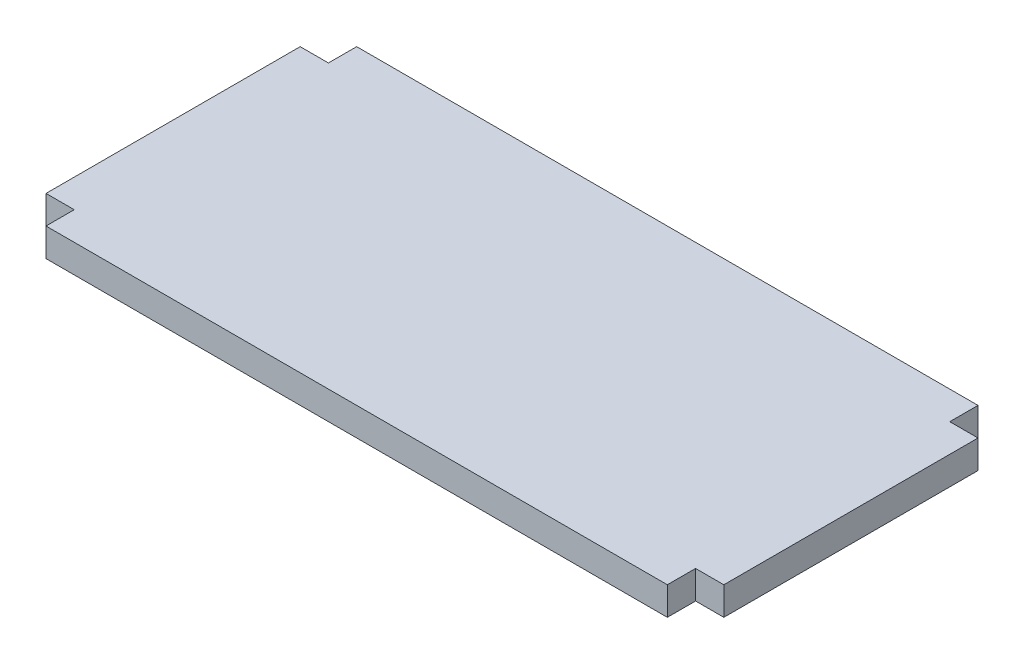
ISO-10303-21;
HEADER;
FILE_DESCRIPTION(('STEP AP214'),'2;1');
FILE_NAME('part.step','',(''),(''),'','','');
FILE_SCHEMA(('AUTOMOTIVE_DESIGN { 1 0 10303 214 1 1 1 1 }'));
ENDSEC;
DATA;
#1=APPLICATION_CONTEXT('core data for automotive mechanical design processes');
#2=APPLICATION_PROTOCOL_DEFINITION('international standard','automotive_design',2000,#1);
#3=PRODUCT_CONTEXT('',#1,'mechanical');
#4=PRODUCT('Part','Part','',(#3));
#5=PRODUCT_RELATED_PRODUCT_CATEGORY('part','',(#4));
#6=PRODUCT_DEFINITION_FORMATION('','',#4);
#7=PRODUCT_DEFINITION_CONTEXT('part definition',#1,'design');
#8=PRODUCT_DEFINITION('design','',#6,#7);
#9=PRODUCT_DEFINITION_SHAPE('','',#8);
#10=(LENGTH_UNIT() NAMED_UNIT(*) SI_UNIT(.MILLI.,.METRE.));
#11=(NAMED_UNIT(*) PLANE_ANGLE_UNIT() SI_UNIT($,.RADIAN.));
#12=(NAMED_UNIT(*) SI_UNIT($,.STERADIAN.) SOLID_ANGLE_UNIT());
#13=UNCERTAINTY_MEASURE_WITH_UNIT(LENGTH_MEASURE(1.E-05),#10,'distance_accuracy_value','');
#14=(GEOMETRIC_REPRESENTATION_CONTEXT(3) GLOBAL_UNCERTAINTY_ASSIGNED_CONTEXT((#13)) GLOBAL_UNIT_ASSIGNED_CONTEXT((#10,
#11,#12)) REPRESENTATION_CONTEXT('',''));
#15=CARTESIAN_POINT('',(0.,0.,0.));
#16=DIRECTION('',(0.,0.,1.));
#17=DIRECTION('',(1.,0.,0.));
#18=AXIS2_PLACEMENT_3D('',#15,#16,#17);
#19=CARTESIAN_POINT('',(0.,50.,225.));
#20=DIRECTION('',(0.,0.,-1.));
#21=DIRECTION('',(-1.,0.,0.));
#22=AXIS2_PLACEMENT_3D('',#19,#20,#21);
#23=PLANE('',#22);
#24=DIRECTION('',(1.,0.,0.));
#25=VECTOR('',#24,1.);
#26=CARTESIAN_POINT('',(0.,0.,225.));
#27=LINE('',#26,#25);
#28=CARTESIAN_POINT('',(-600.,0.,225.));
#29=VERTEX_POINT('',#28);
#30=CARTESIAN_POINT('',(-550.,0.,225.));
#31=VERTEX_POINT('',#30);
#32=EDGE_CURVE('E175',#29,#31,#27,.T.);
#33=ORIENTED_EDGE('',*,*,#32,.T.);
#34=DIRECTION('',(0.,-1.,0.));
#35=VECTOR('',#34,1.);
#36=CARTESIAN_POINT('',(-550.,50.,225.));
#37=LINE('',#36,#35);
#38=CARTESIAN_POINT('',(-550.,50.,225.));
#39=VERTEX_POINT('',#38);
#40=EDGE_CURVE('E11',#39,#31,#37,.T.);
#41=ORIENTED_EDGE('',*,*,#40,.F.);
#42=DIRECTION('',(1.,0.,0.));
#43=VECTOR('',#42,1.);
#44=CARTESIAN_POINT('',(0.,50.,225.));
#45=LINE('',#44,#43);
#46=CARTESIAN_POINT('',(-600.,50.,225.));
#47=VERTEX_POINT('',#46);
#48=EDGE_CURVE('E217',#47,#39,#45,.T.);
#49=ORIENTED_EDGE('',*,*,#48,.F.);
#50=DIRECTION('',(0.,-1.,0.));
#51=VECTOR('',#50,1.);
#52=CARTESIAN_POINT('',(-600.,50.,225.));
#53=LINE('',#52,#51);
#54=EDGE_CURVE('E171',#47,#29,#53,.T.);
#55=ORIENTED_EDGE('',*,*,#54,.T.);
#56=EDGE_LOOP('',(#33,#41,#49,#55));
#57=FACE_BOUND('',#56,.T.);
#58=ADVANCED_FACE('F51',(#57),#23,.F.);
#59=CARTESIAN_POINT('',(-549.999999999999,50.,-1.22124532708768E-12));
#60=DIRECTION('',(1.,0.,0.));
#61=DIRECTION('',(0.,0.,-1.));
#62=AXIS2_PLACEMENT_3D('',#59,#60,#61);
#63=PLANE('',#62);
#64=DIRECTION('',(0.,0.,1.));
#65=VECTOR('',#64,1.);
#66=CARTESIAN_POINT('',(-549.999999999999,0.,-1.22124532708768E-12));
#67=LINE('',#66,#65);
#68=CARTESIAN_POINT('',(-550.,0.,275.));
#69=VERTEX_POINT('',#68);
#70=EDGE_CURVE('E179',#31,#69,#67,.T.);
#71=ORIENTED_EDGE('',*,*,#70,.T.);
#72=DIRECTION('',(0.,-1.,0.));
#73=VECTOR('',#72,1.);
#74=CARTESIAN_POINT('',(-550.,50.,275.));
#75=LINE('',#74,#73);
#76=CARTESIAN_POINT('',(-550.,50.,275.));
#77=VERTEX_POINT('',#76);
#78=EDGE_CURVE('E60',#77,#69,#75,.T.);
#79=ORIENTED_EDGE('',*,*,#78,.F.);
#80=DIRECTION('',(0.,0.,1.));
#81=VECTOR('',#80,1.);
#82=CARTESIAN_POINT('',(-549.999999999999,50.,-1.22124532708768E-12));
#83=LINE('',#82,#81);
#84=EDGE_CURVE('E119',#39,#77,#83,.T.);
#85=ORIENTED_EDGE('',*,*,#84,.F.);
#86=ORIENTED_EDGE('',*,*,#40,.T.);
#87=EDGE_LOOP('',(#71,#79,#85,#86));
#88=FACE_BOUND('',#87,.T.);
#89=ADVANCED_FACE('F299',(#88),#63,.F.);
#90=CARTESIAN_POINT('',(0.,50.,275.));
#91=DIRECTION('',(0.,0.,-1.));
#92=DIRECTION('',(-1.,0.,0.));
#93=AXIS2_PLACEMENT_3D('',#90,#91,#92);
#94=PLANE('',#93);
#95=DIRECTION('',(1.,0.,0.));
#96=VECTOR('',#95,1.);
#97=CARTESIAN_POINT('',(0.,0.,275.));
#98=LINE('',#97,#96);
#99=CARTESIAN_POINT('',(550.,0.,275.));
#100=VERTEX_POINT('',#99);
#101=EDGE_CURVE('E182',#69,#100,#98,.T.);
#102=ORIENTED_EDGE('',*,*,#101,.T.);
#103=DIRECTION('',(0.,-1.,0.));
#104=VECTOR('',#103,1.);
#105=CARTESIAN_POINT('',(550.,50.,275.));
#106=LINE('',#105,#104);
#107=CARTESIAN_POINT('',(550.,50.,275.));
#108=VERTEX_POINT('',#107);
#109=EDGE_CURVE('E239',#108,#100,#106,.T.);
#110=ORIENTED_EDGE('',*,*,#109,.F.);
#111=DIRECTION('',(1.,0.,0.));
#112=VECTOR('',#111,1.);
#113=CARTESIAN_POINT('',(0.,50.,275.));
#114=LINE('',#113,#112);
#115=EDGE_CURVE('E248',#77,#108,#114,.T.);
#116=ORIENTED_EDGE('',*,*,#115,.F.);
#117=ORIENTED_EDGE('',*,*,#78,.T.);
#118=EDGE_LOOP('',(#102,#110,#116,#117));
#119=FACE_BOUND('',#118,.T.);
#120=ADVANCED_FACE('F246',(#119),#94,.F.);
#121=CARTESIAN_POINT('',(550.,50.,0.));
#122=DIRECTION('',(1.,0.,0.));
#123=DIRECTION('',(0.,0.,-1.));
#124=AXIS2_PLACEMENT_3D('',#121,#122,#123);
#125=PLANE('',#124);
#126=DIRECTION('',(0.,0.,1.));
#127=VECTOR('',#126,1.);
#128=CARTESIAN_POINT('',(550.,0.,0.));
#129=LINE('',#128,#127);
#130=CARTESIAN_POINT('',(550.,0.,225.));
#131=VERTEX_POINT('',#130);
#132=EDGE_CURVE('E186',#131,#100,#129,.T.);
#133=ORIENTED_EDGE('',*,*,#132,.F.);
#134=DIRECTION('',(0.,-1.,0.));
#135=VECTOR('',#134,1.);
#136=CARTESIAN_POINT('',(550.,50.,225.));
#137=LINE('',#136,#135);
#138=CARTESIAN_POINT('',(550.,50.,225.));
#139=VERTEX_POINT('',#138);
#140=EDGE_CURVE('E236',#139,#131,#137,.T.);
#141=ORIENTED_EDGE('',*,*,#140,.F.);
#142=DIRECTION('',(0.,0.,1.));
#143=VECTOR('',#142,1.);
#144=CARTESIAN_POINT('',(550.,50.,0.));
#145=LINE('',#144,#143);
#146=EDGE_CURVE('E259',#139,#108,#145,.T.);
#147=ORIENTED_EDGE('',*,*,#146,.T.);
#148=ORIENTED_EDGE('',*,*,#109,.T.);
#149=EDGE_LOOP('',(#133,#141,#147,#148));
#150=FACE_BOUND('',#149,.T.);
#151=ADVANCED_FACE('F255',(#150),#125,.T.);
#152=CARTESIAN_POINT('',(0.,50.,225.));
#153=DIRECTION('',(0.,0.,-1.));
#154=DIRECTION('',(-1.,0.,0.));
#155=AXIS2_PLACEMENT_3D('',#152,#153,#154);
#156=PLANE('',#155);
#157=DIRECTION('',(1.,0.,0.));
#158=VECTOR('',#157,1.);
#159=CARTESIAN_POINT('',(0.,0.,225.));
#160=LINE('',#159,#158);
#161=CARTESIAN_POINT('',(600.,0.,225.));
#162=VERTEX_POINT('',#161);
#163=EDGE_CURVE('E190',#131,#162,#160,.T.);
#164=ORIENTED_EDGE('',*,*,#163,.T.);
#165=DIRECTION('',(0.,-1.,0.));
#166=VECTOR('',#165,1.);
#167=CARTESIAN_POINT('',(600.,50.,225.));
#168=LINE('',#167,#166);
#169=CARTESIAN_POINT('',(600.,50.,225.));
#170=VERTEX_POINT('',#169);
#171=EDGE_CURVE('E233',#170,#162,#168,.T.);
#172=ORIENTED_EDGE('',*,*,#171,.F.);
#173=DIRECTION('',(1.,0.,0.));
#174=VECTOR('',#173,1.);
#175=CARTESIAN_POINT('',(0.,50.,225.));
#176=LINE('',#175,#174);
#177=EDGE_CURVE('E261',#139,#170,#176,.T.);
#178=ORIENTED_EDGE('',*,*,#177,.F.);
#179=ORIENTED_EDGE('',*,*,#140,.T.);
#180=EDGE_LOOP('',(#164,#172,#178,#179));
#181=FACE_BOUND('',#180,.T.);
#182=ADVANCED_FACE('F310',(#181),#156,.F.);
#183=CARTESIAN_POINT('',(600.,50.,-1.21115239050017E-13));
#184=DIRECTION('',(1.,0.,0.));
#185=DIRECTION('',(0.,0.,-1.));
#186=AXIS2_PLACEMENT_3D('',#183,#184,#185);
#187=PLANE('',#186);
#188=DIRECTION('',(0.,0.,1.));
#189=VECTOR('',#188,1.);
#190=CARTESIAN_POINT('',(600.,0.,-1.21115239050017E-13));
#191=LINE('',#190,#189);
#192=CARTESIAN_POINT('',(600.,0.,-225.));
#193=VERTEX_POINT('',#192);
#194=EDGE_CURVE('E194',#193,#162,#191,.T.);
#195=ORIENTED_EDGE('',*,*,#194,.F.);
#196=DIRECTION('',(0.,-1.,0.));
#197=VECTOR('',#196,1.);
#198=CARTESIAN_POINT('',(600.,50.,-225.));
#199=LINE('',#198,#197);
#200=CARTESIAN_POINT('',(600.,50.,-225.));
#201=VERTEX_POINT('',#200);
#202=EDGE_CURVE('E230',#201,#193,#199,.T.);
#203=ORIENTED_EDGE('',*,*,#202,.F.);
#204=DIRECTION('',(0.,0.,1.));
#205=VECTOR('',#204,1.);
#206=CARTESIAN_POINT('',(600.,50.,-1.21115239050017E-13));
#207=LINE('',#206,#205);
#208=EDGE_CURVE('E265',#201,#170,#207,.T.);
#209=ORIENTED_EDGE('',*,*,#208,.T.);
#210=ORIENTED_EDGE('',*,*,#171,.T.);
#211=EDGE_LOOP('',(#195,#203,#209,#210));
#212=FACE_BOUND('',#211,.T.);
#213=ADVANCED_FACE('F313',(#212),#187,.T.);
#214=CARTESIAN_POINT('',(0.,50.,-225.));
#215=DIRECTION('',(0.,0.,-1.));
#216=DIRECTION('',(-1.,0.,0.));
#217=AXIS2_PLACEMENT_3D('',#214,#215,#216);
#218=PLANE('',#217);
#219=DIRECTION('',(1.,0.,0.));
#220=VECTOR('',#219,1.);
#221=CARTESIAN_POINT('',(0.,0.,-225.));
#222=LINE('',#221,#220);
#223=CARTESIAN_POINT('',(550.,0.,-225.));
#224=VERTEX_POINT('',#223);
#225=EDGE_CURVE('E198',#224,#193,#222,.T.);
#226=ORIENTED_EDGE('',*,*,#225,.F.);
#227=DIRECTION('',(0.,-1.,0.));
#228=VECTOR('',#227,1.);
#229=CARTESIAN_POINT('',(550.,50.,-225.));
#230=LINE('',#229,#228);
#231=CARTESIAN_POINT('',(550.,50.,-225.));
#232=VERTEX_POINT('',#231);
#233=EDGE_CURVE('E227',#232,#224,#230,.T.);
#234=ORIENTED_EDGE('',*,*,#233,.F.);
#235=DIRECTION('',(1.,0.,0.));
#236=VECTOR('',#235,1.);
#237=CARTESIAN_POINT('',(0.,50.,-225.));
#238=LINE('',#237,#236);
#239=EDGE_CURVE('E273',#232,#201,#238,.T.);
#240=ORIENTED_EDGE('',*,*,#239,.T.);
#241=ORIENTED_EDGE('',*,*,#202,.T.);
#242=EDGE_LOOP('',(#226,#234,#240,#241));
#243=FACE_BOUND('',#242,.T.);
#244=ADVANCED_FACE('F317',(#243),#218,.T.);
#245=CARTESIAN_POINT('',(550.,50.,0.));
#246=DIRECTION('',(1.,0.,0.));
#247=DIRECTION('',(0.,0.,-1.));
#248=AXIS2_PLACEMENT_3D('',#245,#246,#247);
#249=PLANE('',#248);
#250=DIRECTION('',(0.,0.,1.));
#251=VECTOR('',#250,1.);
#252=CARTESIAN_POINT('',(550.,0.,0.));
#253=LINE('',#252,#251);
#254=CARTESIAN_POINT('',(550.,0.,-275.));
#255=VERTEX_POINT('',#254);
#256=EDGE_CURVE('E202',#255,#224,#253,.T.);
#257=ORIENTED_EDGE('',*,*,#256,.F.);
#258=DIRECTION('',(0.,-1.,0.));
#259=VECTOR('',#258,1.);
#260=CARTESIAN_POINT('',(550.,50.,-275.));
#261=LINE('',#260,#259);
#262=CARTESIAN_POINT('',(550.,50.,-275.));
#263=VERTEX_POINT('',#262);
#264=EDGE_CURVE('E224',#263,#255,#261,.T.);
#265=ORIENTED_EDGE('',*,*,#264,.F.);
#266=DIRECTION('',(0.,0.,1.));
#267=VECTOR('',#266,1.);
#268=CARTESIAN_POINT('',(550.,50.,0.));
#269=LINE('',#268,#267);
#270=EDGE_CURVE('E277',#263,#232,#269,.T.);
#271=ORIENTED_EDGE('',*,*,#270,.T.);
#272=ORIENTED_EDGE('',*,*,#233,.T.);
#273=EDGE_LOOP('',(#257,#265,#271,#272));
#274=FACE_BOUND('',#273,.T.);
#275=ADVANCED_FACE('F321',(#274),#249,.T.);
#276=CARTESIAN_POINT('',(0.,50.,-275.));
#277=DIRECTION('',(0.,0.,-1.));
#278=DIRECTION('',(-1.,0.,0.));
#279=AXIS2_PLACEMENT_3D('',#276,#277,#278);
#280=PLANE('',#279);
#281=DIRECTION('',(1.,0.,0.));
#282=VECTOR('',#281,1.);
#283=CARTESIAN_POINT('',(0.,0.,-275.));
#284=LINE('',#283,#282);
#285=CARTESIAN_POINT('',(-550.,0.,-275.));
#286=VERTEX_POINT('',#285);
#287=EDGE_CURVE('E206',#286,#255,#284,.T.);
#288=ORIENTED_EDGE('',*,*,#287,.F.);
#289=DIRECTION('',(0.,-1.,0.));
#290=VECTOR('',#289,1.);
#291=CARTESIAN_POINT('',(-550.,50.,-275.));
#292=LINE('',#291,#290);
#293=CARTESIAN_POINT('',(-550.,50.,-275.));
#294=VERTEX_POINT('',#293);
#295=EDGE_CURVE('E165',#294,#286,#292,.T.);
#296=ORIENTED_EDGE('',*,*,#295,.F.);
#297=DIRECTION('',(1.,0.,0.));
#298=VECTOR('',#297,1.);
#299=CARTESIAN_POINT('',(0.,50.,-275.));
#300=LINE('',#299,#298);
#301=EDGE_CURVE('E152',#294,#263,#300,.T.);
#302=ORIENTED_EDGE('',*,*,#301,.T.);
#303=ORIENTED_EDGE('',*,*,#264,.T.);
#304=EDGE_LOOP('',(#288,#296,#302,#303));
#305=FACE_BOUND('',#304,.T.);
#306=ADVANCED_FACE('F283',(#305),#280,.T.);
#307=CARTESIAN_POINT('',(-550.000000000001,50.,-1.22124532708768E-12));
#308=DIRECTION('',(1.,0.,0.));
#309=DIRECTION('',(0.,0.,-1.));
#310=AXIS2_PLACEMENT_3D('',#307,#308,#309);
#311=PLANE('',#310);
#312=DIRECTION('',(0.,0.,1.));
#313=VECTOR('',#312,1.);
#314=CARTESIAN_POINT('',(-550.000000000001,0.,-1.22124532708768E-12));
#315=LINE('',#314,#313);
#316=CARTESIAN_POINT('',(-550.,0.,-225.));
#317=VERTEX_POINT('',#316);
#318=EDGE_CURVE('E160',#286,#317,#315,.T.);
#319=ORIENTED_EDGE('',*,*,#318,.T.);
#320=DIRECTION('',(0.,-1.,0.));
#321=VECTOR('',#320,1.);
#322=CARTESIAN_POINT('',(-550.,50.,-225.));
#323=LINE('',#322,#321);
#324=CARTESIAN_POINT('',(-550.,50.,-225.));
#325=VERTEX_POINT('',#324);
#326=EDGE_CURVE('E157',#325,#317,#323,.T.);
#327=ORIENTED_EDGE('',*,*,#326,.F.);
#328=DIRECTION('',(0.,0.,1.));
#329=VECTOR('',#328,1.);
#330=CARTESIAN_POINT('',(-550.000000000001,50.,-1.22124532708768E-12));
#331=LINE('',#330,#329);
#332=EDGE_CURVE('E145',#294,#325,#331,.T.);
#333=ORIENTED_EDGE('',*,*,#332,.F.);
#334=ORIENTED_EDGE('',*,*,#295,.T.);
#335=EDGE_LOOP('',(#319,#327,#333,#334));
#336=FACE_BOUND('',#335,.T.);
#337=ADVANCED_FACE('F158',(#336),#311,.F.);
#338=CARTESIAN_POINT('',(0.,50.,-225.));
#339=DIRECTION('',(0.,0.,-1.));
#340=DIRECTION('',(-1.,0.,0.));
#341=AXIS2_PLACEMENT_3D('',#338,#339,#340);
#342=PLANE('',#341);
#343=DIRECTION('',(1.,0.,0.));
#344=VECTOR('',#343,1.);
#345=CARTESIAN_POINT('',(0.,0.,-225.));
#346=LINE('',#345,#344);
#347=CARTESIAN_POINT('',(-600.,0.,-225.));
#348=VERTEX_POINT('',#347);
#349=EDGE_CURVE('E212',#348,#317,#346,.T.);
#350=ORIENTED_EDGE('',*,*,#349,.F.);
#351=DIRECTION('',(0.,-1.,0.));
#352=VECTOR('',#351,1.);
#353=CARTESIAN_POINT('',(-600.,50.,-225.));
#354=LINE('',#353,#352);
#355=CARTESIAN_POINT('',(-600.,50.,-225.));
#356=VERTEX_POINT('',#355);
#357=EDGE_CURVE('E108',#356,#348,#354,.T.);
#358=ORIENTED_EDGE('',*,*,#357,.F.);
#359=DIRECTION('',(1.,0.,0.));
#360=VECTOR('',#359,1.);
#361=CARTESIAN_POINT('',(0.,50.,-225.));
#362=LINE('',#361,#360);
#363=EDGE_CURVE('E149',#356,#325,#362,.T.);
#364=ORIENTED_EDGE('',*,*,#363,.T.);
#365=ORIENTED_EDGE('',*,*,#326,.T.);
#366=EDGE_LOOP('',(#350,#358,#364,#365));
#367=FACE_BOUND('',#366,.T.);
#368=ADVANCED_FACE('F167',(#367),#342,.T.);
#369=CARTESIAN_POINT('',(-600.,50.,1.21115239050017E-13));
#370=DIRECTION('',(1.,0.,0.));
#371=DIRECTION('',(0.,0.,-1.));
#372=AXIS2_PLACEMENT_3D('',#369,#370,#371);
#373=PLANE('',#372);
#374=DIRECTION('',(0.,0.,1.));
#375=VECTOR('',#374,1.);
#376=CARTESIAN_POINT('',(-600.,0.,1.21115239050017E-13));
#377=LINE('',#376,#375);
#378=EDGE_CURVE('E111',#348,#29,#377,.T.);
#379=ORIENTED_EDGE('',*,*,#378,.T.);
#380=ORIENTED_EDGE('',*,*,#54,.F.);
#381=DIRECTION('',(0.,0.,1.));
#382=VECTOR('',#381,1.);
#383=CARTESIAN_POINT('',(-600.,50.,1.21115239050017E-13));
#384=LINE('',#383,#382);
#385=EDGE_CURVE('E68',#356,#47,#384,.T.);
#386=ORIENTED_EDGE('',*,*,#385,.F.);
#387=ORIENTED_EDGE('',*,*,#357,.T.);
#388=EDGE_LOOP('',(#379,#380,#386,#387));
#389=FACE_BOUND('',#388,.T.);
#390=ADVANCED_FACE('F288',(#389),#373,.F.);
#391=CARTESIAN_POINT('',(0.,50.,0.));
#392=DIRECTION('',(0.,1.,0.));
#393=DIRECTION('',(0.,0.,1.));
#394=AXIS2_PLACEMENT_3D('',#391,#392,#393);
#395=PLANE('',#394);
#396=ORIENTED_EDGE('',*,*,#48,.T.);
#397=ORIENTED_EDGE('',*,*,#84,.T.);
#398=ORIENTED_EDGE('',*,*,#115,.T.);
#399=ORIENTED_EDGE('',*,*,#146,.F.);
#400=ORIENTED_EDGE('',*,*,#177,.T.);
#401=ORIENTED_EDGE('',*,*,#208,.F.);
#402=ORIENTED_EDGE('',*,*,#239,.F.);
#403=ORIENTED_EDGE('',*,*,#270,.F.);
#404=ORIENTED_EDGE('',*,*,#301,.F.);
#405=ORIENTED_EDGE('',*,*,#332,.T.);
#406=ORIENTED_EDGE('',*,*,#363,.F.);
#407=ORIENTED_EDGE('',*,*,#385,.T.);
#408=EDGE_LOOP('',(#396,#397,#398,#399,#400,#401,#402,#403,#404,#405,#406,#407));
#409=FACE_BOUND('',#408,.T.);
#410=ADVANCED_FACE('F147',(#409),#395,.T.);
#411=CARTESIAN_POINT('',(0.,0.,0.));
#412=DIRECTION('',(0.,1.,0.));
#413=DIRECTION('',(0.,0.,1.));
#414=AXIS2_PLACEMENT_3D('',#411,#412,#413);
#415=PLANE('',#414);
#416=ORIENTED_EDGE('',*,*,#32,.F.);
#417=ORIENTED_EDGE('',*,*,#378,.F.);
#418=ORIENTED_EDGE('',*,*,#349,.T.);
#419=ORIENTED_EDGE('',*,*,#318,.F.);
#420=ORIENTED_EDGE('',*,*,#287,.T.);
#421=ORIENTED_EDGE('',*,*,#256,.T.);
#422=ORIENTED_EDGE('',*,*,#225,.T.);
#423=ORIENTED_EDGE('',*,*,#194,.T.);
#424=ORIENTED_EDGE('',*,*,#163,.F.);
#425=ORIENTED_EDGE('',*,*,#132,.T.);
#426=ORIENTED_EDGE('',*,*,#101,.F.);
#427=ORIENTED_EDGE('',*,*,#70,.F.);
#428=EDGE_LOOP('',(#416,#417,#418,#419,#420,#421,#422,#423,#424,#425,#426,#427));
#429=FACE_BOUND('',#428,.T.);
#430=ADVANCED_FACE('F251',(#429),#415,.F.);
#431=CLOSED_SHELL('',(#58,#89,#120,#151,#182,#213,#244,#275,#306,#337,#368,#390,#410,#430));
#432=MANIFOLD_SOLID_BREP('B2',#431);
#433=ADVANCED_BREP_SHAPE_REPRESENTATION('',(#18,#432),#14);
#434=SHAPE_DEFINITION_REPRESENTATION(#9,#433);
ENDSEC;
END-ISO-10303-21;
